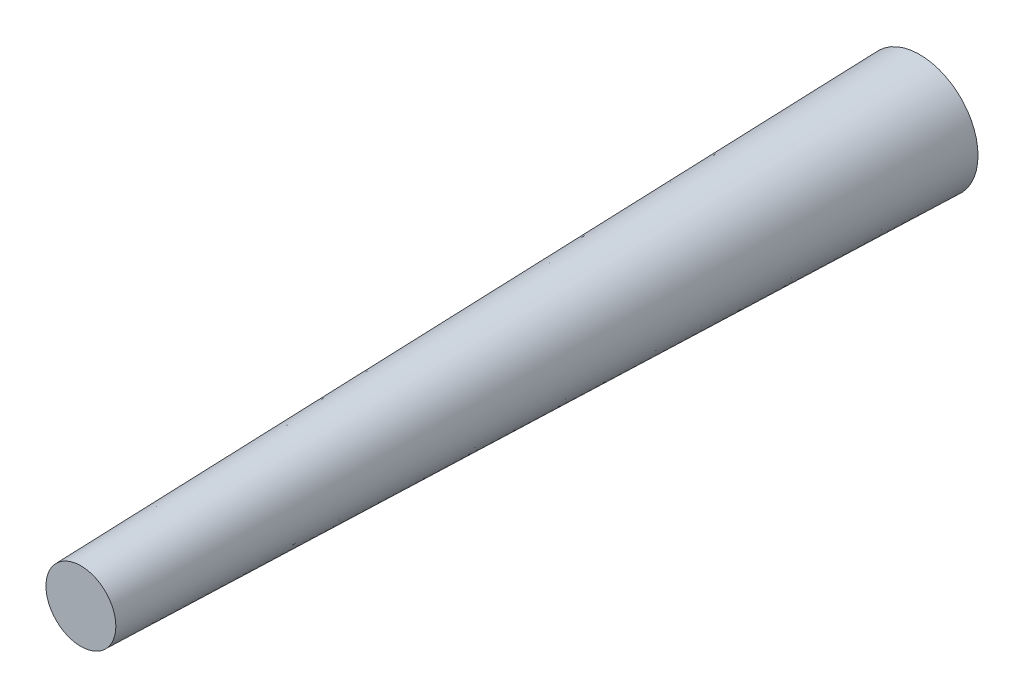
ISO-10303-21;
HEADER;
FILE_DESCRIPTION(('STEP AP214'),'2;1');
FILE_NAME('part.step','',(''),(''),'','','');
FILE_SCHEMA(('AUTOMOTIVE_DESIGN { 1 0 10303 214 1 1 1 1 }'));
ENDSEC;
DATA;
#1=APPLICATION_CONTEXT('core data for automotive mechanical design processes');
#2=APPLICATION_PROTOCOL_DEFINITION('international standard','automotive_design',2000,#1);
#3=PRODUCT_CONTEXT('',#1,'mechanical');
#4=PRODUCT('Part','Part','',(#3));
#5=PRODUCT_RELATED_PRODUCT_CATEGORY('part','',(#4));
#6=PRODUCT_DEFINITION_FORMATION('','',#4);
#7=PRODUCT_DEFINITION_CONTEXT('part definition',#1,'design');
#8=PRODUCT_DEFINITION('design','',#6,#7);
#9=PRODUCT_DEFINITION_SHAPE('','',#8);
#10=(LENGTH_UNIT() NAMED_UNIT(*) SI_UNIT(.MILLI.,.METRE.));
#11=(NAMED_UNIT(*) PLANE_ANGLE_UNIT() SI_UNIT($,.RADIAN.));
#12=(NAMED_UNIT(*) SI_UNIT($,.STERADIAN.) SOLID_ANGLE_UNIT());
#13=UNCERTAINTY_MEASURE_WITH_UNIT(LENGTH_MEASURE(1.E-05),#10,'distance_accuracy_value','');
#14=(GEOMETRIC_REPRESENTATION_CONTEXT(3) GLOBAL_UNCERTAINTY_ASSIGNED_CONTEXT((#13)) GLOBAL_UNIT_ASSIGNED_CONTEXT((#10,
#11,#12)) REPRESENTATION_CONTEXT('',''));
#15=CARTESIAN_POINT('',(0.,0.,0.));
#16=DIRECTION('',(0.,0.,1.));
#17=DIRECTION('',(1.,0.,0.));
#18=AXIS2_PLACEMENT_3D('',#15,#16,#17);
#19=CARTESIAN_POINT('',(0.,0.,-18.0001000000001));
#20=DIRECTION('',(0.,0.,-1.));
#21=DIRECTION('',(-1.,0.,0.));
#22=AXIS2_PLACEMENT_3D('',#19,#20,#21);
#23=CONICAL_SURFACE('',#22,2.50000000000001,0.0277705594926329);
#24=CARTESIAN_POINT('',(0.,0.,18.));
#25=DIRECTION('',(0.,0.,1.));
#26=DIRECTION('',(1.,0.,0.));
#27=AXIS2_PLACEMENT_3D('',#24,#25,#26);
#28=CIRCLE('',#27,1.5);
#29=CARTESIAN_POINT('',(1.5,0.,18.));
#30=VERTEX_POINT('',#29);
#31=EDGE_CURVE('E51',#30,#30,#28,.T.);
#32=ORIENTED_EDGE('',*,*,#31,.F.);
#33=EDGE_LOOP('',(#32));
#34=FACE_BOUND('',#33,.T.);
#35=CARTESIAN_POINT('',(0.,0.,-18.0001000000001));
#36=DIRECTION('',(0.,0.,1.));
#37=DIRECTION('',(1.,0.,0.));
#38=AXIS2_PLACEMENT_3D('',#35,#36,#37);
#39=CIRCLE('',#38,2.50000000000001);
#40=CARTESIAN_POINT('',(2.50000000000001,0.,-18.0001000000001));
#41=VERTEX_POINT('',#40);
#42=EDGE_CURVE('E11',#41,#41,#39,.T.);
#43=ORIENTED_EDGE('',*,*,#42,.T.);
#44=EDGE_LOOP('',(#43));
#45=FACE_BOUND('',#44,.T.);
#46=ADVANCED_FACE('F42',(#34,#45),#23,.T.);
#47=CARTESIAN_POINT('',(0.,0.,-18.0001000000001));
#48=DIRECTION('',(0.,0.,1.));
#49=DIRECTION('',(1.,0.,0.));
#50=AXIS2_PLACEMENT_3D('',#47,#48,#49);
#51=PLANE('',#50);
#52=ORIENTED_EDGE('',*,*,#42,.F.);
#53=EDGE_LOOP('',(#52));
#54=FACE_BOUND('',#53,.T.);
#55=ADVANCED_FACE('F61',(#54),#51,.F.);
#56=CARTESIAN_POINT('',(0.,0.,18.));
#57=DIRECTION('',(0.,0.,-1.));
#58=DIRECTION('',(-1.,0.,0.));
#59=AXIS2_PLACEMENT_3D('',#56,#57,#58);
#60=PLANE('',#59);
#61=ORIENTED_EDGE('',*,*,#31,.T.);
#62=EDGE_LOOP('',(#61));
#63=FACE_BOUND('',#62,.T.);
#64=ADVANCED_FACE('F58',(#63),#60,.F.);
#65=CLOSED_SHELL('',(#46,#55,#64));
#66=MANIFOLD_SOLID_BREP('B2',#65);
#67=ADVANCED_BREP_SHAPE_REPRESENTATION('',(#18,#66),#14);
#68=SHAPE_DEFINITION_REPRESENTATION(#9,#67);
ENDSEC;
END-ISO-10303-21;
